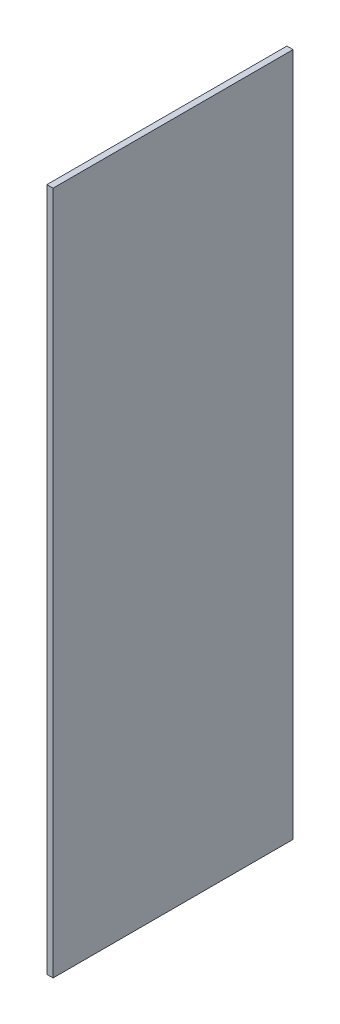
ISO-10303-21;
HEADER;
FILE_DESCRIPTION(('STEP AP214'),'2;1');
FILE_NAME('part.step','',(''),(''),'','','');
FILE_SCHEMA(('AUTOMOTIVE_DESIGN { 1 0 10303 214 1 1 1 1 }'));
ENDSEC;
DATA;
#1=APPLICATION_CONTEXT('core data for automotive mechanical design processes');
#2=APPLICATION_PROTOCOL_DEFINITION('international standard','automotive_design',2000,#1);
#3=PRODUCT_CONTEXT('',#1,'mechanical');
#4=PRODUCT('Part','Part','',(#3));
#5=PRODUCT_RELATED_PRODUCT_CATEGORY('part','',(#4));
#6=PRODUCT_DEFINITION_FORMATION('','',#4);
#7=PRODUCT_DEFINITION_CONTEXT('part definition',#1,'design');
#8=PRODUCT_DEFINITION('design','',#6,#7);
#9=PRODUCT_DEFINITION_SHAPE('','',#8);
#10=(LENGTH_UNIT() NAMED_UNIT(*) SI_UNIT(.MILLI.,.METRE.));
#11=(NAMED_UNIT(*) PLANE_ANGLE_UNIT() SI_UNIT($,.RADIAN.));
#12=(NAMED_UNIT(*) SI_UNIT($,.STERADIAN.) SOLID_ANGLE_UNIT());
#13=UNCERTAINTY_MEASURE_WITH_UNIT(LENGTH_MEASURE(1.E-05),#10,'distance_accuracy_value','');
#14=(GEOMETRIC_REPRESENTATION_CONTEXT(3) GLOBAL_UNCERTAINTY_ASSIGNED_CONTEXT((#13)) GLOBAL_UNIT_ASSIGNED_CONTEXT((#10,
#11,#12)) REPRESENTATION_CONTEXT('',''));
#15=CARTESIAN_POINT('',(0.,0.,0.));
#16=DIRECTION('',(0.,0.,1.));
#17=DIRECTION('',(1.,0.,0.));
#18=AXIS2_PLACEMENT_3D('',#15,#16,#17);
#19=CARTESIAN_POINT('',(0.,58.7500000000001,42.25));
#20=DIRECTION('',(-1.,0.,0.));
#21=DIRECTION('',(0.,0.,1.));
#22=AXIS2_PLACEMENT_3D('',#19,#20,#21);
#23=PLANE('',#22);
#24=DIRECTION('',(0.,1.,0.));
#25=VECTOR('',#24,1.);
#26=CARTESIAN_POINT('',(0.,98.5000000000002,39.55));
#27=LINE('',#26,#25);
#28=CARTESIAN_POINT('',(0.,-7.14999999999988,39.5500000000001));
#29=VERTEX_POINT('',#28);
#30=CARTESIAN_POINT('',(0.,98.1500000000001,39.55));
#31=VERTEX_POINT('',#30);
#32=EDGE_CURVE('E101',#29,#31,#27,.T.);
#33=ORIENTED_EDGE('',*,*,#32,.T.);
#34=DIRECTION('',(0.,0.,-1.));
#35=VECTOR('',#34,1.);
#36=CARTESIAN_POINT('',(0.,98.1500000000001,5.50000000000002));
#37=LINE('',#36,#35);
#38=CARTESIAN_POINT('',(0.,98.1500000000001,6.10000000000002));
#39=VERTEX_POINT('',#38);
#40=EDGE_CURVE('E94',#31,#39,#37,.T.);
#41=ORIENTED_EDGE('',*,*,#40,.T.);
#42=DIRECTION('',(0.,-1.,0.));
#43=VECTOR('',#42,1.);
#44=CARTESIAN_POINT('',(0.,8.25000000000011,6.10000000000003));
#45=LINE('',#44,#43);
#46=CARTESIAN_POINT('',(0.,-7.14999999999988,6.10000000000003));
#47=VERTEX_POINT('',#46);
#48=EDGE_CURVE('E78',#39,#47,#45,.T.);
#49=ORIENTED_EDGE('',*,*,#48,.T.);
#50=DIRECTION('',(0.,0.,1.));
#51=VECTOR('',#50,1.);
#52=CARTESIAN_POINT('',(0.,-7.14999999999988,39.5));
#53=LINE('',#52,#51);
#54=EDGE_CURVE('E19',#47,#29,#53,.T.);
#55=ORIENTED_EDGE('',*,*,#54,.T.);
#56=EDGE_LOOP('',(#33,#41,#49,#55));
#57=FACE_BOUND('',#56,.T.);
#58=ADVANCED_FACE('F16',(#57),#23,.T.);
#59=CARTESIAN_POINT('',(0.,-7.14999999999988,39.5));
#60=DIRECTION('',(0.,1.,0.));
#61=DIRECTION('',(0.,0.,1.));
#62=AXIS2_PLACEMENT_3D('',#59,#60,#61);
#63=PLANE('',#62);
#64=DIRECTION('',(0.,0.,1.));
#65=VECTOR('',#64,1.);
#66=CARTESIAN_POINT('',(0.5,-7.14999999999989,42.25));
#67=LINE('',#66,#65);
#68=CARTESIAN_POINT('',(0.5,-7.14999999999988,39.55));
#69=VERTEX_POINT('',#68);
#70=CARTESIAN_POINT('',(0.5,-7.14999999999988,6.10000000000004));
#71=VERTEX_POINT('',#70);
#72=EDGE_CURVE('E107',#69,#71,#67,.F.);
#73=ORIENTED_EDGE('',*,*,#72,.F.);
#74=DIRECTION('',(1.,0.,0.));
#75=VECTOR('',#74,1.);
#76=CARTESIAN_POINT('',(0.,-7.14999999999988,39.55));
#77=LINE('',#76,#75);
#78=EDGE_CURVE('E89',#69,#29,#77,.F.);
#79=ORIENTED_EDGE('',*,*,#78,.T.);
#80=ORIENTED_EDGE('',*,*,#54,.F.);
#81=DIRECTION('',(1.,0.,0.));
#82=VECTOR('',#81,1.);
#83=CARTESIAN_POINT('',(0.,-7.14999999999988,6.10000000000003));
#84=LINE('',#83,#82);
#85=EDGE_CURVE('E87',#47,#71,#84,.T.);
#86=ORIENTED_EDGE('',*,*,#85,.T.);
#87=EDGE_LOOP('',(#73,#79,#80,#86));
#88=FACE_BOUND('',#87,.T.);
#89=ADVANCED_FACE('F86',(#88),#63,.F.);
#90=CARTESIAN_POINT('',(0.,8.25000000000011,6.10000000000003));
#91=DIRECTION('',(0.,0.,1.));
#92=DIRECTION('',(0.,-1.,0.));
#93=AXIS2_PLACEMENT_3D('',#90,#91,#92);
#94=PLANE('',#93);
#95=DIRECTION('',(0.,1.,0.));
#96=VECTOR('',#95,1.);
#97=CARTESIAN_POINT('',(0.5,58.7500000000001,6.10000000000004));
#98=LINE('',#97,#96);
#99=CARTESIAN_POINT('',(0.5,98.1500000000001,6.10000000000002));
#100=VERTEX_POINT('',#99);
#101=EDGE_CURVE('E93',#71,#100,#98,.T.);
#102=ORIENTED_EDGE('',*,*,#101,.F.);
#103=ORIENTED_EDGE('',*,*,#85,.F.);
#104=ORIENTED_EDGE('',*,*,#48,.F.);
#105=DIRECTION('',(1.,0.,0.));
#106=VECTOR('',#105,1.);
#107=CARTESIAN_POINT('',(0.,98.1500000000001,6.10000000000002));
#108=LINE('',#107,#106);
#109=EDGE_CURVE('E99',#39,#100,#108,.T.);
#110=ORIENTED_EDGE('',*,*,#109,.T.);
#111=EDGE_LOOP('',(#102,#103,#104,#110));
#112=FACE_BOUND('',#111,.T.);
#113=ADVANCED_FACE('F92',(#112),#94,.F.);
#114=CARTESIAN_POINT('',(0.,98.1500000000001,5.50000000000002));
#115=DIRECTION('',(0.,-1.,0.));
#116=DIRECTION('',(0.,0.,-1.));
#117=AXIS2_PLACEMENT_3D('',#114,#115,#116);
#118=PLANE('',#117);
#119=DIRECTION('',(0.,0.,1.));
#120=VECTOR('',#119,1.);
#121=CARTESIAN_POINT('',(0.5,98.1500000000001,42.25));
#122=LINE('',#121,#120);
#123=CARTESIAN_POINT('',(0.5,98.1500000000001,39.55));
#124=VERTEX_POINT('',#123);
#125=EDGE_CURVE('E110',#100,#124,#122,.T.);
#126=ORIENTED_EDGE('',*,*,#125,.F.);
#127=ORIENTED_EDGE('',*,*,#109,.F.);
#128=ORIENTED_EDGE('',*,*,#40,.F.);
#129=DIRECTION('',(1.,0.,0.));
#130=VECTOR('',#129,1.);
#131=CARTESIAN_POINT('',(0.,98.1500000000001,39.55));
#132=LINE('',#131,#130);
#133=EDGE_CURVE('E103',#31,#124,#132,.T.);
#134=ORIENTED_EDGE('',*,*,#133,.T.);
#135=EDGE_LOOP('',(#126,#127,#128,#134));
#136=FACE_BOUND('',#135,.T.);
#137=ADVANCED_FACE('F176',(#136),#118,.F.);
#138=CARTESIAN_POINT('',(0.,98.5000000000002,39.55));
#139=DIRECTION('',(0.,0.,-1.));
#140=DIRECTION('',(0.,1.,0.));
#141=AXIS2_PLACEMENT_3D('',#138,#139,#140);
#142=PLANE('',#141);
#143=DIRECTION('',(0.,1.,0.));
#144=VECTOR('',#143,1.);
#145=CARTESIAN_POINT('',(0.5,58.7500000000001,39.55));
#146=LINE('',#145,#144);
#147=EDGE_CURVE('E112',#124,#69,#146,.F.);
#148=ORIENTED_EDGE('',*,*,#147,.F.);
#149=ORIENTED_EDGE('',*,*,#133,.F.);
#150=ORIENTED_EDGE('',*,*,#32,.F.);
#151=ORIENTED_EDGE('',*,*,#78,.F.);
#152=EDGE_LOOP('',(#148,#149,#150,#151));
#153=FACE_BOUND('',#152,.T.);
#154=ADVANCED_FACE('F172',(#153),#142,.F.);
#155=CARTESIAN_POINT('',(0.5,58.7500000000001,42.25));
#156=DIRECTION('',(-1.,0.,0.));
#157=DIRECTION('',(0.,0.,1.));
#158=AXIS2_PLACEMENT_3D('',#155,#156,#157);
#159=PLANE('',#158);
#160=DIRECTION('',(0.,-1.,0.));
#161=VECTOR('',#160,1.);
#162=CARTESIAN_POINT('',(0.5,5.85000000000012,42.25));
#163=LINE('',#162,#161);
#164=CARTESIAN_POINT('',(0.5,100.85,42.25));
#165=VERTEX_POINT('',#164);
#166=CARTESIAN_POINT('',(0.5,-9.84999999999989,42.25));
#167=VERTEX_POINT('',#166);
#168=EDGE_CURVE('E121',#165,#167,#163,.T.);
#169=ORIENTED_EDGE('',*,*,#168,.F.);
#170=DIRECTION('',(0.,0.,1.));
#171=VECTOR('',#170,1.);
#172=CARTESIAN_POINT('',(0.5,100.85,42.25));
#173=LINE('',#172,#171);
#174=CARTESIAN_POINT('',(0.5,100.85,3.40000000000002));
#175=VERTEX_POINT('',#174);
#176=EDGE_CURVE('E125',#175,#165,#173,.T.);
#177=ORIENTED_EDGE('',*,*,#176,.F.);
#178=DIRECTION('',(0.,1.,0.));
#179=VECTOR('',#178,1.);
#180=CARTESIAN_POINT('',(0.5,102.25,3.40000000000002));
#181=LINE('',#180,#179);
#182=CARTESIAN_POINT('',(0.5,-9.84999999999989,3.40000000000003));
#183=VERTEX_POINT('',#182);
#184=EDGE_CURVE('E115',#183,#175,#181,.T.);
#185=ORIENTED_EDGE('',*,*,#184,.F.);
#186=DIRECTION('',(0.,0.,-1.));
#187=VECTOR('',#186,1.);
#188=CARTESIAN_POINT('',(0.5,-9.84999999999989,2.25000000000004));
#189=LINE('',#188,#187);
#190=EDGE_CURVE('E117',#167,#183,#189,.T.);
#191=ORIENTED_EDGE('',*,*,#190,.F.);
#192=EDGE_LOOP('',(#169,#177,#185,#191));
#193=FACE_BOUND('',#192,.T.);
#194=ORIENTED_EDGE('',*,*,#125,.T.);
#195=ORIENTED_EDGE('',*,*,#147,.T.);
#196=ORIENTED_EDGE('',*,*,#72,.T.);
#197=ORIENTED_EDGE('',*,*,#101,.T.);
#198=EDGE_LOOP('',(#194,#195,#196,#197));
#199=FACE_BOUND('',#198,.T.);
#200=ADVANCED_FACE('F169',(#193,#199),#159,.T.);
#201=CARTESIAN_POINT('',(0.,102.25,3.40000000000002));
#202=DIRECTION('',(0.,0.,-1.));
#203=DIRECTION('',(0.,1.,0.));
#204=AXIS2_PLACEMENT_3D('',#201,#202,#203);
#205=PLANE('',#204);
#206=DIRECTION('',(0.,1.,0.));
#207=VECTOR('',#206,1.);
#208=CARTESIAN_POINT('',(1.5,58.7500000000001,3.40000000000002));
#209=LINE('',#208,#207);
#210=CARTESIAN_POINT('',(1.5,100.85,3.40000000000002));
#211=VERTEX_POINT('',#210);
#212=CARTESIAN_POINT('',(1.5,-9.84999999999989,3.40000000000004));
#213=VERTEX_POINT('',#212);
#214=EDGE_CURVE('E131',#211,#213,#209,.F.);
#215=ORIENTED_EDGE('',*,*,#214,.T.);
#216=DIRECTION('',(1.,0.,0.));
#217=VECTOR('',#216,1.);
#218=CARTESIAN_POINT('',(0.,-9.84999999999989,3.40000000000004));
#219=LINE('',#218,#217);
#220=EDGE_CURVE('E119',#183,#213,#219,.T.);
#221=ORIENTED_EDGE('',*,*,#220,.F.);
#222=ORIENTED_EDGE('',*,*,#184,.T.);
#223=DIRECTION('',(1.,0.,0.));
#224=VECTOR('',#223,1.);
#225=CARTESIAN_POINT('',(0.,100.85,3.40000000000002));
#226=LINE('',#225,#224);
#227=EDGE_CURVE('E128',#211,#175,#226,.F.);
#228=ORIENTED_EDGE('',*,*,#227,.F.);
#229=EDGE_LOOP('',(#215,#221,#222,#228));
#230=FACE_BOUND('',#229,.T.);
#231=ADVANCED_FACE('F151',(#230),#205,.T.);
#232=CARTESIAN_POINT('',(0.,-9.84999999999989,2.25000000000004));
#233=DIRECTION('',(0.,-1.,0.));
#234=DIRECTION('',(0.,0.,-1.));
#235=AXIS2_PLACEMENT_3D('',#232,#233,#234);
#236=PLANE('',#235);
#237=DIRECTION('',(0.,0.,1.));
#238=VECTOR('',#237,1.);
#239=CARTESIAN_POINT('',(1.5,-9.84999999999989,42.25));
#240=LINE('',#239,#238);
#241=CARTESIAN_POINT('',(1.5,-9.84999999999988,42.25));
#242=VERTEX_POINT('',#241);
#243=EDGE_CURVE('E134',#213,#242,#240,.T.);
#244=ORIENTED_EDGE('',*,*,#243,.T.);
#245=DIRECTION('',(1.,0.,0.));
#246=VECTOR('',#245,1.);
#247=CARTESIAN_POINT('',(0.,-9.84999999999988,42.25));
#248=LINE('',#247,#246);
#249=EDGE_CURVE('E123',#167,#242,#248,.T.);
#250=ORIENTED_EDGE('',*,*,#249,.F.);
#251=ORIENTED_EDGE('',*,*,#190,.T.);
#252=ORIENTED_EDGE('',*,*,#220,.T.);
#253=EDGE_LOOP('',(#244,#250,#251,#252));
#254=FACE_BOUND('',#253,.T.);
#255=ADVANCED_FACE('F146',(#254),#236,.T.);
#256=CARTESIAN_POINT('',(0.,5.85000000000012,42.25));
#257=DIRECTION('',(0.,0.,1.));
#258=DIRECTION('',(0.,-1.,0.));
#259=AXIS2_PLACEMENT_3D('',#256,#257,#258);
#260=PLANE('',#259);
#261=DIRECTION('',(0.,1.,0.));
#262=VECTOR('',#261,1.);
#263=CARTESIAN_POINT('',(1.5,58.7500000000001,42.25));
#264=LINE('',#263,#262);
#265=CARTESIAN_POINT('',(1.5,100.85,42.25));
#266=VERTEX_POINT('',#265);
#267=EDGE_CURVE('E25',#242,#266,#264,.T.);
#268=ORIENTED_EDGE('',*,*,#267,.T.);
#269=DIRECTION('',(1.,0.,0.));
#270=VECTOR('',#269,1.);
#271=CARTESIAN_POINT('',(0.,100.85,42.25));
#272=LINE('',#271,#270);
#273=EDGE_CURVE('E33',#165,#266,#272,.T.);
#274=ORIENTED_EDGE('',*,*,#273,.F.);
#275=ORIENTED_EDGE('',*,*,#168,.T.);
#276=ORIENTED_EDGE('',*,*,#249,.T.);
#277=EDGE_LOOP('',(#268,#274,#275,#276));
#278=FACE_BOUND('',#277,.T.);
#279=ADVANCED_FACE('F140',(#278),#260,.T.);
#280=CARTESIAN_POINT('',(0.,100.85,42.25));
#281=DIRECTION('',(0.,1.,0.));
#282=DIRECTION('',(0.,0.,1.));
#283=AXIS2_PLACEMENT_3D('',#280,#281,#282);
#284=PLANE('',#283);
#285=DIRECTION('',(0.,0.,1.));
#286=VECTOR('',#285,1.);
#287=CARTESIAN_POINT('',(1.5,100.85,42.25));
#288=LINE('',#287,#286);
#289=EDGE_CURVE('E11',#266,#211,#288,.F.);
#290=ORIENTED_EDGE('',*,*,#289,.T.);
#291=ORIENTED_EDGE('',*,*,#227,.T.);
#292=ORIENTED_EDGE('',*,*,#176,.T.);
#293=ORIENTED_EDGE('',*,*,#273,.T.);
#294=EDGE_LOOP('',(#290,#291,#292,#293));
#295=FACE_BOUND('',#294,.T.);
#296=ADVANCED_FACE('F154',(#295),#284,.T.);
#297=CARTESIAN_POINT('',(1.5,58.7500000000001,42.25));
#298=DIRECTION('',(-1.,0.,0.));
#299=DIRECTION('',(0.,0.,1.));
#300=AXIS2_PLACEMENT_3D('',#297,#298,#299);
#301=PLANE('',#300);
#302=ORIENTED_EDGE('',*,*,#267,.F.);
#303=ORIENTED_EDGE('',*,*,#243,.F.);
#304=ORIENTED_EDGE('',*,*,#214,.F.);
#305=ORIENTED_EDGE('',*,*,#289,.F.);
#306=EDGE_LOOP('',(#302,#303,#304,#305));
#307=FACE_BOUND('',#306,.T.);
#308=ADVANCED_FACE('F144',(#307),#301,.F.);
#309=CLOSED_SHELL('',(#58,#89,#113,#137,#154,#200,#231,#255,#279,#296,#308));
#310=MANIFOLD_SOLID_BREP('B1',#309);
#311=ADVANCED_BREP_SHAPE_REPRESENTATION('',(#18,#310),#14);
#312=SHAPE_DEFINITION_REPRESENTATION(#9,#311);
ENDSEC;
END-ISO-10303-21;
